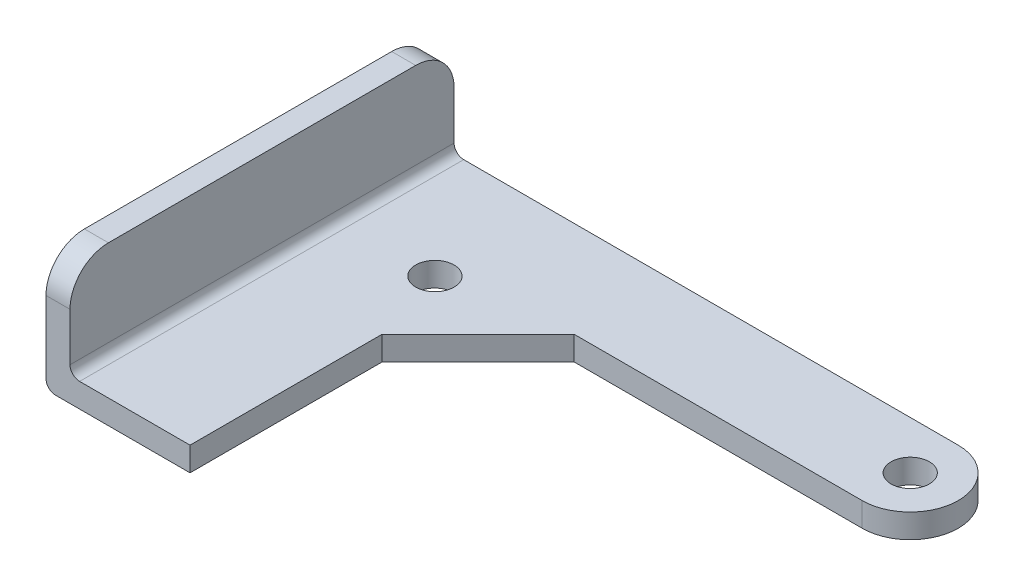
ISO-10303-21;
HEADER;
FILE_DESCRIPTION(('STEP AP214'),'2;1');
FILE_NAME('part.step','',(''),(''),'','','');
FILE_SCHEMA(('AUTOMOTIVE_DESIGN { 1 0 10303 214 1 1 1 1 }'));
ENDSEC;
DATA;
#1=APPLICATION_CONTEXT('core data for automotive mechanical design processes');
#2=APPLICATION_PROTOCOL_DEFINITION('international standard','automotive_design',2000,#1);
#3=PRODUCT_CONTEXT('',#1,'mechanical');
#4=PRODUCT('Part','Part','',(#3));
#5=PRODUCT_RELATED_PRODUCT_CATEGORY('part','',(#4));
#6=PRODUCT_DEFINITION_FORMATION('','',#4);
#7=PRODUCT_DEFINITION_CONTEXT('part definition',#1,'design');
#8=PRODUCT_DEFINITION('design','',#6,#7);
#9=PRODUCT_DEFINITION_SHAPE('','',#8);
#10=(LENGTH_UNIT() NAMED_UNIT(*) SI_UNIT(.MILLI.,.METRE.));
#11=(NAMED_UNIT(*) PLANE_ANGLE_UNIT() SI_UNIT($,.RADIAN.));
#12=(NAMED_UNIT(*) SI_UNIT($,.STERADIAN.) SOLID_ANGLE_UNIT());
#13=UNCERTAINTY_MEASURE_WITH_UNIT(LENGTH_MEASURE(1.E-05),#10,'distance_accuracy_value','');
#14=(GEOMETRIC_REPRESENTATION_CONTEXT(3) GLOBAL_UNCERTAINTY_ASSIGNED_CONTEXT((#13)) GLOBAL_UNIT_ASSIGNED_CONTEXT((#10,
#11,#12)) REPRESENTATION_CONTEXT('',''));
#15=CARTESIAN_POINT('',(0.,0.,0.));
#16=DIRECTION('',(0.,0.,1.));
#17=DIRECTION('',(1.,0.,0.));
#18=AXIS2_PLACEMENT_3D('',#15,#16,#17);
#19=CARTESIAN_POINT('',(0.,12.5,0.));
#20=DIRECTION('',(1.,0.,0.));
#21=DIRECTION('',(0.,0.,-1.));
#22=AXIS2_PLACEMENT_3D('',#19,#20,#21);
#23=PLANE('',#22);
#24=DIRECTION('',(0.,-1.,0.));
#25=VECTOR('',#24,1.);
#26=CARTESIAN_POINT('',(0.,12.5,0.));
#27=LINE('',#26,#25);
#28=CARTESIAN_POINT('',(0.,72.4999999999997,0.));
#29=VERTEX_POINT('',#28);
#30=CARTESIAN_POINT('',(0.,-2.5,0.));
#31=VERTEX_POINT('',#30);
#32=EDGE_CURVE('E152',#29,#31,#27,.T.);
#33=ORIENTED_EDGE('',*,*,#32,.T.);
#34=DIRECTION('',(0.,0.,1.));
#35=VECTOR('',#34,1.);
#36=CARTESIAN_POINT('',(0.,-2.5,400.));
#37=LINE('',#36,#35);
#38=CARTESIAN_POINT('',(0.,-2.5,400.));
#39=VERTEX_POINT('',#38);
#40=EDGE_CURVE('E197',#31,#39,#37,.T.);
#41=ORIENTED_EDGE('',*,*,#40,.T.);
#42=DIRECTION('',(0.,-1.,0.));
#43=VECTOR('',#42,1.);
#44=CARTESIAN_POINT('',(0.,12.5,400.));
#45=LINE('',#44,#43);
#46=CARTESIAN_POINT('',(0.,72.4999999999997,400.));
#47=VERTEX_POINT('',#46);
#48=EDGE_CURVE('E186',#47,#39,#45,.T.);
#49=ORIENTED_EDGE('',*,*,#48,.F.);
#50=CARTESIAN_POINT('',(0.,72.5,360.));
#51=DIRECTION('',(-1.,0.,0.));
#52=DIRECTION('',(0.,0.,1.));
#53=AXIS2_PLACEMENT_3D('',#50,#51,#52);
#54=CIRCLE('',#53,40.);
#55=CARTESIAN_POINT('',(0.,112.5,360.));
#56=VERTEX_POINT('',#55);
#57=EDGE_CURVE('E262',#47,#56,#54,.T.);
#58=ORIENTED_EDGE('',*,*,#57,.T.);
#59=DIRECTION('',(0.,0.,1.));
#60=VECTOR('',#59,1.);
#61=CARTESIAN_POINT('',(0.,112.5,0.));
#62=LINE('',#61,#60);
#63=CARTESIAN_POINT('',(0.,112.5,40.0000000000003));
#64=VERTEX_POINT('',#63);
#65=EDGE_CURVE('E156',#64,#56,#62,.T.);
#66=ORIENTED_EDGE('',*,*,#65,.F.);
#67=CARTESIAN_POINT('',(0.,72.5,40.));
#68=DIRECTION('',(-1.,0.,0.));
#69=DIRECTION('',(0.,0.,1.));
#70=AXIS2_PLACEMENT_3D('',#67,#68,#69);
#71=CIRCLE('',#70,40.);
#72=EDGE_CURVE('E138',#64,#29,#71,.T.);
#73=ORIENTED_EDGE('',*,*,#72,.T.);
#74=EDGE_LOOP('',(#33,#41,#49,#58,#66,#73));
#75=FACE_BOUND('',#74,.T.);
#76=ADVANCED_FACE('F41',(#75),#23,.F.);
#77=CARTESIAN_POINT('',(0.,12.5,0.));
#78=DIRECTION('',(0.,0.,1.));
#79=DIRECTION('',(1.,0.,0.));
#80=AXIS2_PLACEMENT_3D('',#77,#78,#79);
#81=PLANE('',#80);
#82=DIRECTION('',(-1.,0.,0.));
#83=VECTOR('',#82,1.);
#84=CARTESIAN_POINT('',(0.,-12.5,0.));
#85=LINE('',#84,#83);
#86=CARTESIAN_POINT('',(550.,-12.5,0.));
#87=VERTEX_POINT('',#86);
#88=CARTESIAN_POINT('',(10.,-12.5,0.));
#89=VERTEX_POINT('',#88);
#90=EDGE_CURVE('E172',#87,#89,#85,.T.);
#91=ORIENTED_EDGE('',*,*,#90,.T.);
#92=CARTESIAN_POINT('',(10.,-2.5,0.));
#93=DIRECTION('',(0.,0.,1.));
#94=DIRECTION('',(1.,0.,0.));
#95=AXIS2_PLACEMENT_3D('',#92,#93,#94);
#96=CIRCLE('',#95,10.);
#97=EDGE_CURVE('E161',#89,#31,#96,.F.);
#98=ORIENTED_EDGE('',*,*,#97,.T.);
#99=ORIENTED_EDGE('',*,*,#32,.F.);
#100=DIRECTION('',(-1.,0.,0.));
#101=VECTOR('',#100,1.);
#102=CARTESIAN_POINT('',(600.,72.4999999999997,0.));
#103=LINE('',#102,#101);
#104=CARTESIAN_POINT('',(25.,72.4999999999997,0.));
#105=VERTEX_POINT('',#104);
#106=EDGE_CURVE('E135',#105,#29,#103,.T.);
#107=ORIENTED_EDGE('',*,*,#106,.F.);
#108=DIRECTION('',(0.,-1.,0.));
#109=VECTOR('',#108,1.);
#110=CARTESIAN_POINT('',(25.,112.5,0.));
#111=LINE('',#110,#109);
#112=CARTESIAN_POINT('',(25.,22.5,0.));
#113=VERTEX_POINT('',#112);
#114=EDGE_CURVE('E202',#105,#113,#111,.T.);
#115=ORIENTED_EDGE('',*,*,#114,.T.);
#116=CARTESIAN_POINT('',(35.,22.5,0.));
#117=DIRECTION('',(0.,0.,1.));
#118=DIRECTION('',(1.,0.,0.));
#119=AXIS2_PLACEMENT_3D('',#116,#117,#118);
#120=CIRCLE('',#119,10.);
#121=CARTESIAN_POINT('',(35.,12.5,0.));
#122=VERTEX_POINT('',#121);
#123=EDGE_CURVE('E49',#113,#122,#120,.T.);
#124=ORIENTED_EDGE('',*,*,#123,.T.);
#125=DIRECTION('',(-1.,0.,0.));
#126=VECTOR('',#125,1.);
#127=CARTESIAN_POINT('',(0.,12.5,0.));
#128=LINE('',#127,#126);
#129=CARTESIAN_POINT('',(550.,12.5,0.));
#130=VERTEX_POINT('',#129);
#131=EDGE_CURVE('E163',#130,#122,#128,.T.);
#132=ORIENTED_EDGE('',*,*,#131,.F.);
#133=DIRECTION('',(0.,-1.,0.));
#134=VECTOR('',#133,1.);
#135=CARTESIAN_POINT('',(550.,12.5,0.));
#136=LINE('',#135,#134);
#137=EDGE_CURVE('E162',#130,#87,#136,.T.);
#138=ORIENTED_EDGE('',*,*,#137,.T.);
#139=EDGE_LOOP('',(#91,#98,#99,#107,#115,#124,#132,#138));
#140=FACE_BOUND('',#139,.T.);
#141=ADVANCED_FACE('F159',(#140),#81,.F.);
#142=CARTESIAN_POINT('',(25.,112.5,0.));
#143=DIRECTION('',(-1.,0.,0.));
#144=DIRECTION('',(0.,0.,1.));
#145=AXIS2_PLACEMENT_3D('',#142,#143,#144);
#146=PLANE('',#145);
#147=DIRECTION('',(0.,-1.,0.));
#148=VECTOR('',#147,1.);
#149=CARTESIAN_POINT('',(25.,112.5,400.));
#150=LINE('',#149,#148);
#151=CARTESIAN_POINT('',(25.,72.4999999999997,400.));
#152=VERTEX_POINT('',#151);
#153=CARTESIAN_POINT('',(25.,22.5,400.));
#154=VERTEX_POINT('',#153);
#155=EDGE_CURVE('E217',#152,#154,#150,.T.);
#156=ORIENTED_EDGE('',*,*,#155,.T.);
#157=DIRECTION('',(0.,0.,-1.));
#158=VECTOR('',#157,1.);
#159=CARTESIAN_POINT('',(25.,22.5,0.));
#160=LINE('',#159,#158);
#161=EDGE_CURVE('E192',#154,#113,#160,.T.);
#162=ORIENTED_EDGE('',*,*,#161,.T.);
#163=ORIENTED_EDGE('',*,*,#114,.F.);
#164=CARTESIAN_POINT('',(25.,72.5,40.));
#165=DIRECTION('',(-1.,0.,0.));
#166=DIRECTION('',(0.,0.,1.));
#167=AXIS2_PLACEMENT_3D('',#164,#165,#166);
#168=CIRCLE('',#167,40.);
#169=CARTESIAN_POINT('',(25.,112.5,40.0000000000003));
#170=VERTEX_POINT('',#169);
#171=EDGE_CURVE('E141',#170,#105,#168,.T.);
#172=ORIENTED_EDGE('',*,*,#171,.F.);
#173=DIRECTION('',(0.,0.,-1.));
#174=VECTOR('',#173,1.);
#175=CARTESIAN_POINT('',(25.,112.5,0.));
#176=LINE('',#175,#174);
#177=CARTESIAN_POINT('',(25.,112.5,360.));
#178=VERTEX_POINT('',#177);
#179=EDGE_CURVE('E229',#178,#170,#176,.T.);
#180=ORIENTED_EDGE('',*,*,#179,.F.);
#181=CARTESIAN_POINT('',(25.,72.5,360.));
#182=DIRECTION('',(-1.,0.,0.));
#183=DIRECTION('',(0.,0.,1.));
#184=AXIS2_PLACEMENT_3D('',#181,#182,#183);
#185=CIRCLE('',#184,40.);
#186=EDGE_CURVE('E146',#152,#178,#185,.T.);
#187=ORIENTED_EDGE('',*,*,#186,.F.);
#188=EDGE_LOOP('',(#156,#162,#163,#172,#180,#187));
#189=FACE_BOUND('',#188,.T.);
#190=ADVANCED_FACE('F222',(#189),#146,.F.);
#191=CARTESIAN_POINT('',(0.,112.5,0.));
#192=DIRECTION('',(0.,1.,0.));
#193=DIRECTION('',(0.,0.,1.));
#194=AXIS2_PLACEMENT_3D('',#191,#192,#193);
#195=PLANE('',#194);
#196=ORIENTED_EDGE('',*,*,#179,.T.);
#197=DIRECTION('',(-1.,0.,0.));
#198=VECTOR('',#197,1.);
#199=CARTESIAN_POINT('',(600.,112.5,39.9999999999999));
#200=LINE('',#199,#198);
#201=EDGE_CURVE('E190',#170,#64,#200,.T.);
#202=ORIENTED_EDGE('',*,*,#201,.T.);
#203=ORIENTED_EDGE('',*,*,#65,.T.);
#204=DIRECTION('',(-1.,0.,0.));
#205=VECTOR('',#204,1.);
#206=CARTESIAN_POINT('',(600.,112.5,360.));
#207=LINE('',#206,#205);
#208=EDGE_CURVE('E188',#178,#56,#207,.T.);
#209=ORIENTED_EDGE('',*,*,#208,.F.);
#210=EDGE_LOOP('',(#196,#202,#203,#209));
#211=FACE_BOUND('',#210,.T.);
#212=ADVANCED_FACE('F271',(#211),#195,.T.);
#213=CARTESIAN_POINT('',(550.,12.5,50.));
#214=DIRECTION('',(0.,-1.,0.));
#215=DIRECTION('',(0.,0.,-1.));
#216=AXIS2_PLACEMENT_3D('',#213,#214,#215);
#217=PLANE('',#216);
#218=CARTESIAN_POINT('',(125.,12.5,120.));
#219=DIRECTION('',(0.,1.,0.));
#220=DIRECTION('',(0.,0.,1.));
#221=AXIS2_PLACEMENT_3D('',#218,#219,#220);
#222=CIRCLE('',#221,20.);
#223=CARTESIAN_POINT('',(125.,12.5,140.));
#224=VERTEX_POINT('',#223);
#225=EDGE_CURVE('E227',#224,#224,#222,.T.);
#226=ORIENTED_EDGE('',*,*,#225,.F.);
#227=EDGE_LOOP('',(#226));
#228=FACE_BOUND('',#227,.T.);
#229=CARTESIAN_POINT('',(550.,12.5,50.));
#230=DIRECTION('',(0.,1.,0.));
#231=DIRECTION('',(0.,0.,1.));
#232=AXIS2_PLACEMENT_3D('',#229,#230,#231);
#233=CIRCLE('',#232,20.);
#234=CARTESIAN_POINT('',(550.,12.5,70.));
#235=VERTEX_POINT('',#234);
#236=EDGE_CURVE('E236',#235,#235,#233,.T.);
#237=ORIENTED_EDGE('',*,*,#236,.F.);
#238=EDGE_LOOP('',(#237));
#239=FACE_BOUND('',#238,.T.);
#240=ORIENTED_EDGE('',*,*,#131,.T.);
#241=DIRECTION('',(0.,0.,-1.));
#242=VECTOR('',#241,1.);
#243=CARTESIAN_POINT('',(35.,12.5,400.));
#244=LINE('',#243,#242);
#245=CARTESIAN_POINT('',(35.,12.5,400.));
#246=VERTEX_POINT('',#245);
#247=EDGE_CURVE('E195',#122,#246,#244,.F.);
#248=ORIENTED_EDGE('',*,*,#247,.T.);
#249=DIRECTION('',(1.,0.,0.));
#250=VECTOR('',#249,1.);
#251=CARTESIAN_POINT('',(0.,12.5,400.));
#252=LINE('',#251,#250);
#253=CARTESIAN_POINT('',(150.,12.5,400.));
#254=VERTEX_POINT('',#253);
#255=EDGE_CURVE('E219',#246,#254,#252,.T.);
#256=ORIENTED_EDGE('',*,*,#255,.T.);
#257=DIRECTION('',(0.,0.,-1.));
#258=VECTOR('',#257,1.);
#259=CARTESIAN_POINT('',(150.,12.5,400.));
#260=LINE('',#259,#258);
#261=CARTESIAN_POINT('',(150.,12.5,200.));
#262=VERTEX_POINT('',#261);
#263=EDGE_CURVE('E243',#254,#262,#260,.T.);
#264=ORIENTED_EDGE('',*,*,#263,.T.);
#265=DIRECTION('',(0.707106781186546,0.,-0.707106781186549));
#266=VECTOR('',#265,1.);
#267=CARTESIAN_POINT('',(150.,12.5,200.));
#268=LINE('',#267,#266);
#269=CARTESIAN_POINT('',(250.,12.5,100.));
#270=VERTEX_POINT('',#269);
#271=EDGE_CURVE('E245',#262,#270,#268,.T.);
#272=ORIENTED_EDGE('',*,*,#271,.T.);
#273=DIRECTION('',(1.,0.,0.));
#274=VECTOR('',#273,1.);
#275=CARTESIAN_POINT('',(250.,12.5,100.));
#276=LINE('',#275,#274);
#277=CARTESIAN_POINT('',(550.,12.5,100.));
#278=VERTEX_POINT('',#277);
#279=EDGE_CURVE('E247',#270,#278,#276,.T.);
#280=ORIENTED_EDGE('',*,*,#279,.T.);
#281=CARTESIAN_POINT('',(550.,12.5,50.));
#282=DIRECTION('',(0.,1.,0.));
#283=DIRECTION('',(0.,0.,-1.));
#284=AXIS2_PLACEMENT_3D('',#281,#282,#283);
#285=CIRCLE('',#284,50.);
#286=EDGE_CURVE('E169',#278,#130,#285,.T.);
#287=ORIENTED_EDGE('',*,*,#286,.T.);
#288=EDGE_LOOP('',(#240,#248,#256,#264,#272,#280,#287));
#289=FACE_BOUND('',#288,.T.);
#290=ADVANCED_FACE('F207',(#228,#239,#289),#217,.F.);
#291=CARTESIAN_POINT('',(550.,-12.5,50.));
#292=DIRECTION('',(0.,-1.,0.));
#293=DIRECTION('',(0.,0.,-1.));
#294=AXIS2_PLACEMENT_3D('',#291,#292,#293);
#295=PLANE('',#294);
#296=CARTESIAN_POINT('',(550.,-12.5,50.));
#297=DIRECTION('',(0.,1.,0.));
#298=DIRECTION('',(0.,0.,1.));
#299=AXIS2_PLACEMENT_3D('',#296,#297,#298);
#300=CIRCLE('',#299,20.);
#301=CARTESIAN_POINT('',(550.,-12.5,70.));
#302=VERTEX_POINT('',#301);
#303=EDGE_CURVE('E234',#302,#302,#300,.T.);
#304=ORIENTED_EDGE('',*,*,#303,.T.);
#305=EDGE_LOOP('',(#304));
#306=FACE_BOUND('',#305,.T.);
#307=DIRECTION('',(1.,0.,0.));
#308=VECTOR('',#307,1.);
#309=CARTESIAN_POINT('',(0.,-12.5,400.));
#310=LINE('',#309,#308);
#311=CARTESIAN_POINT('',(10.,-12.5,400.));
#312=VERTEX_POINT('',#311);
#313=CARTESIAN_POINT('',(150.,-12.5,400.));
#314=VERTEX_POINT('',#313);
#315=EDGE_CURVE('E239',#312,#314,#310,.T.);
#316=ORIENTED_EDGE('',*,*,#315,.F.);
#317=DIRECTION('',(0.,0.,1.));
#318=VECTOR('',#317,1.);
#319=CARTESIAN_POINT('',(10.,-12.5,0.));
#320=LINE('',#319,#318);
#321=EDGE_CURVE('E56',#312,#89,#320,.F.);
#322=ORIENTED_EDGE('',*,*,#321,.T.);
#323=ORIENTED_EDGE('',*,*,#90,.F.);
#324=CARTESIAN_POINT('',(550.,-12.5,50.));
#325=DIRECTION('',(0.,1.,0.));
#326=DIRECTION('',(0.,0.,-1.));
#327=AXIS2_PLACEMENT_3D('',#324,#325,#326);
#328=CIRCLE('',#327,50.);
#329=CARTESIAN_POINT('',(550.,-12.5,100.));
#330=VERTEX_POINT('',#329);
#331=EDGE_CURVE('E256',#330,#87,#328,.T.);
#332=ORIENTED_EDGE('',*,*,#331,.F.);
#333=DIRECTION('',(1.,0.,0.));
#334=VECTOR('',#333,1.);
#335=CARTESIAN_POINT('',(250.,-12.5,100.));
#336=LINE('',#335,#334);
#337=CARTESIAN_POINT('',(250.,-12.5,100.));
#338=VERTEX_POINT('',#337);
#339=EDGE_CURVE('E255',#338,#330,#336,.T.);
#340=ORIENTED_EDGE('',*,*,#339,.F.);
#341=DIRECTION('',(0.707106781186546,0.,-0.707106781186549));
#342=VECTOR('',#341,1.);
#343=CARTESIAN_POINT('',(150.,-12.5,200.));
#344=LINE('',#343,#342);
#345=CARTESIAN_POINT('',(150.,-12.5,200.));
#346=VERTEX_POINT('',#345);
#347=EDGE_CURVE('E253',#346,#338,#344,.T.);
#348=ORIENTED_EDGE('',*,*,#347,.F.);
#349=DIRECTION('',(0.,0.,-1.));
#350=VECTOR('',#349,1.);
#351=CARTESIAN_POINT('',(150.,-12.5,400.));
#352=LINE('',#351,#350);
#353=EDGE_CURVE('E251',#314,#346,#352,.T.);
#354=ORIENTED_EDGE('',*,*,#353,.F.);
#355=EDGE_LOOP('',(#316,#322,#323,#332,#340,#348,#354));
#356=FACE_BOUND('',#355,.T.);
#357=CARTESIAN_POINT('',(125.,-12.5,120.));
#358=DIRECTION('',(0.,1.,0.));
#359=DIRECTION('',(0.,0.,1.));
#360=AXIS2_PLACEMENT_3D('',#357,#358,#359);
#361=CIRCLE('',#360,20.);
#362=CARTESIAN_POINT('',(125.,-12.5,140.));
#363=VERTEX_POINT('',#362);
#364=EDGE_CURVE('E224',#363,#363,#361,.T.);
#365=ORIENTED_EDGE('',*,*,#364,.T.);
#366=EDGE_LOOP('',(#365));
#367=FACE_BOUND('',#366,.T.);
#368=ADVANCED_FACE('F316',(#306,#356,#367),#295,.T.);
#369=CARTESIAN_POINT('',(0.,12.5,400.));
#370=DIRECTION('',(0.,0.,-1.));
#371=DIRECTION('',(-1.,0.,0.));
#372=AXIS2_PLACEMENT_3D('',#369,#370,#371);
#373=PLANE('',#372);
#374=ORIENTED_EDGE('',*,*,#48,.T.);
#375=CARTESIAN_POINT('',(10.,-2.5,400.));
#376=DIRECTION('',(0.,0.,-1.));
#377=DIRECTION('',(-1.,0.,0.));
#378=AXIS2_PLACEMENT_3D('',#375,#376,#377);
#379=CIRCLE('',#378,10.);
#380=EDGE_CURVE('E64',#39,#312,#379,.F.);
#381=ORIENTED_EDGE('',*,*,#380,.T.);
#382=ORIENTED_EDGE('',*,*,#315,.T.);
#383=DIRECTION('',(0.,-1.,0.));
#384=VECTOR('',#383,1.);
#385=CARTESIAN_POINT('',(150.,12.5,400.));
#386=LINE('',#385,#384);
#387=EDGE_CURVE('E183',#254,#314,#386,.T.);
#388=ORIENTED_EDGE('',*,*,#387,.F.);
#389=ORIENTED_EDGE('',*,*,#255,.F.);
#390=CARTESIAN_POINT('',(35.,22.5,400.));
#391=DIRECTION('',(0.,0.,-1.));
#392=DIRECTION('',(-1.,0.,0.));
#393=AXIS2_PLACEMENT_3D('',#390,#391,#392);
#394=CIRCLE('',#393,10.);
#395=EDGE_CURVE('E11',#246,#154,#394,.T.);
#396=ORIENTED_EDGE('',*,*,#395,.T.);
#397=ORIENTED_EDGE('',*,*,#155,.F.);
#398=DIRECTION('',(-1.,0.,0.));
#399=VECTOR('',#398,1.);
#400=CARTESIAN_POINT('',(600.,72.4999999999997,400.));
#401=LINE('',#400,#399);
#402=EDGE_CURVE('E157',#152,#47,#401,.T.);
#403=ORIENTED_EDGE('',*,*,#402,.T.);
#404=EDGE_LOOP('',(#374,#381,#382,#388,#389,#396,#397,#403));
#405=FACE_BOUND('',#404,.T.);
#406=ADVANCED_FACE('F215',(#405),#373,.F.);
#407=CARTESIAN_POINT('',(150.,12.5,400.));
#408=DIRECTION('',(-1.,0.,0.));
#409=DIRECTION('',(0.,0.,1.));
#410=AXIS2_PLACEMENT_3D('',#407,#408,#409);
#411=PLANE('',#410);
#412=ORIENTED_EDGE('',*,*,#353,.T.);
#413=DIRECTION('',(0.,-1.,0.));
#414=VECTOR('',#413,1.);
#415=CARTESIAN_POINT('',(150.,12.5,200.));
#416=LINE('',#415,#414);
#417=EDGE_CURVE('E180',#262,#346,#416,.T.);
#418=ORIENTED_EDGE('',*,*,#417,.F.);
#419=ORIENTED_EDGE('',*,*,#263,.F.);
#420=ORIENTED_EDGE('',*,*,#387,.T.);
#421=EDGE_LOOP('',(#412,#418,#419,#420));
#422=FACE_BOUND('',#421,.T.);
#423=ADVANCED_FACE('F315',(#422),#411,.F.);
#424=CARTESIAN_POINT('',(150.,12.5,200.));
#425=DIRECTION('',(-0.707106781186549,0.,-0.707106781186546));
#426=DIRECTION('',(-0.707106781186546,0.,0.707106781186549));
#427=AXIS2_PLACEMENT_3D('',#424,#425,#426);
#428=PLANE('',#427);
#429=ORIENTED_EDGE('',*,*,#347,.T.);
#430=DIRECTION('',(0.,-1.,0.));
#431=VECTOR('',#430,1.);
#432=CARTESIAN_POINT('',(250.,12.5,100.));
#433=LINE('',#432,#431);
#434=EDGE_CURVE('E177',#270,#338,#433,.T.);
#435=ORIENTED_EDGE('',*,*,#434,.F.);
#436=ORIENTED_EDGE('',*,*,#271,.F.);
#437=ORIENTED_EDGE('',*,*,#417,.T.);
#438=EDGE_LOOP('',(#429,#435,#436,#437));
#439=FACE_BOUND('',#438,.T.);
#440=ADVANCED_FACE('F413',(#439),#428,.F.);
#441=CARTESIAN_POINT('',(250.,12.5,100.));
#442=DIRECTION('',(0.,0.,-1.));
#443=DIRECTION('',(-1.,0.,0.));
#444=AXIS2_PLACEMENT_3D('',#441,#442,#443);
#445=PLANE('',#444);
#446=ORIENTED_EDGE('',*,*,#339,.T.);
#447=DIRECTION('',(0.,-1.,0.));
#448=VECTOR('',#447,1.);
#449=CARTESIAN_POINT('',(550.,12.5,100.));
#450=LINE('',#449,#448);
#451=EDGE_CURVE('E166',#278,#330,#450,.T.);
#452=ORIENTED_EDGE('',*,*,#451,.F.);
#453=ORIENTED_EDGE('',*,*,#279,.F.);
#454=ORIENTED_EDGE('',*,*,#434,.T.);
#455=EDGE_LOOP('',(#446,#452,#453,#454));
#456=FACE_BOUND('',#455,.T.);
#457=ADVANCED_FACE('F403',(#456),#445,.F.);
#458=CARTESIAN_POINT('',(550.,12.5,50.));
#459=DIRECTION('',(0.,-1.,0.));
#460=DIRECTION('',(0.,0.,-1.));
#461=AXIS2_PLACEMENT_3D('',#458,#459,#460);
#462=CYLINDRICAL_SURFACE('',#461,50.);
#463=ORIENTED_EDGE('',*,*,#331,.T.);
#464=ORIENTED_EDGE('',*,*,#137,.F.);
#465=ORIENTED_EDGE('',*,*,#286,.F.);
#466=ORIENTED_EDGE('',*,*,#451,.T.);
#467=EDGE_LOOP('',(#463,#464,#465,#466));
#468=FACE_BOUND('',#467,.T.);
#469=ADVANCED_FACE('F392',(#468),#462,.T.);
#470=CARTESIAN_POINT('',(550.,12.5,50.));
#471=DIRECTION('',(0.,-1.,0.));
#472=DIRECTION('',(0.,0.,-1.));
#473=AXIS2_PLACEMENT_3D('',#470,#471,#472);
#474=CYLINDRICAL_SURFACE('',#473,20.);
#475=ORIENTED_EDGE('',*,*,#236,.T.);
#476=EDGE_LOOP('',(#475));
#477=FACE_BOUND('',#476,.T.);
#478=ORIENTED_EDGE('',*,*,#303,.F.);
#479=EDGE_LOOP('',(#478));
#480=FACE_BOUND('',#479,.T.);
#481=ADVANCED_FACE('F281',(#477,#480),#474,.F.);
#482=CARTESIAN_POINT('',(125.,12.5,120.));
#483=DIRECTION('',(0.,-1.,0.));
#484=DIRECTION('',(0.,0.,-1.));
#485=AXIS2_PLACEMENT_3D('',#482,#483,#484);
#486=CYLINDRICAL_SURFACE('',#485,20.);
#487=ORIENTED_EDGE('',*,*,#225,.T.);
#488=EDGE_LOOP('',(#487));
#489=FACE_BOUND('',#488,.T.);
#490=ORIENTED_EDGE('',*,*,#364,.F.);
#491=EDGE_LOOP('',(#490));
#492=FACE_BOUND('',#491,.T.);
#493=ADVANCED_FACE('F274',(#489,#492),#486,.F.);
#494=CARTESIAN_POINT('',(600.,72.5,360.));
#495=DIRECTION('',(-1.,0.,0.));
#496=DIRECTION('',(0.,0.,1.));
#497=AXIS2_PLACEMENT_3D('',#494,#495,#496);
#498=CYLINDRICAL_SURFACE('',#497,40.);
#499=ORIENTED_EDGE('',*,*,#186,.T.);
#500=ORIENTED_EDGE('',*,*,#208,.T.);
#501=ORIENTED_EDGE('',*,*,#57,.F.);
#502=ORIENTED_EDGE('',*,*,#402,.F.);
#503=EDGE_LOOP('',(#499,#500,#501,#502));
#504=FACE_BOUND('',#503,.T.);
#505=ADVANCED_FACE('F272',(#504),#498,.T.);
#506=CARTESIAN_POINT('',(600.,72.5,39.9999999999999));
#507=DIRECTION('',(-1.,0.,0.));
#508=DIRECTION('',(0.,0.,1.));
#509=AXIS2_PLACEMENT_3D('',#506,#507,#508);
#510=CYLINDRICAL_SURFACE('',#509,40.);
#511=ORIENTED_EDGE('',*,*,#171,.T.);
#512=ORIENTED_EDGE('',*,*,#106,.T.);
#513=ORIENTED_EDGE('',*,*,#72,.F.);
#514=ORIENTED_EDGE('',*,*,#201,.F.);
#515=EDGE_LOOP('',(#511,#512,#513,#514));
#516=FACE_BOUND('',#515,.T.);
#517=ADVANCED_FACE('F137',(#516),#510,.T.);
#518=CARTESIAN_POINT('',(35.,22.5,0.));
#519=DIRECTION('',(0.,0.,1.));
#520=DIRECTION('',(1.,0.,0.));
#521=AXIS2_PLACEMENT_3D('',#518,#519,#520);
#522=CYLINDRICAL_SURFACE('',#521,10.);
#523=ORIENTED_EDGE('',*,*,#395,.F.);
#524=ORIENTED_EDGE('',*,*,#247,.F.);
#525=ORIENTED_EDGE('',*,*,#123,.F.);
#526=ORIENTED_EDGE('',*,*,#161,.F.);
#527=EDGE_LOOP('',(#523,#524,#525,#526));
#528=FACE_BOUND('',#527,.T.);
#529=ADVANCED_FACE('F212',(#528),#522,.F.);
#530=CARTESIAN_POINT('',(10.,-2.5,0.));
#531=DIRECTION('',(0.,0.,-1.));
#532=DIRECTION('',(-1.,0.,0.));
#533=AXIS2_PLACEMENT_3D('',#530,#531,#532);
#534=CYLINDRICAL_SURFACE('',#533,10.);
#535=ORIENTED_EDGE('',*,*,#97,.F.);
#536=ORIENTED_EDGE('',*,*,#321,.F.);
#537=ORIENTED_EDGE('',*,*,#380,.F.);
#538=ORIENTED_EDGE('',*,*,#40,.F.);
#539=EDGE_LOOP('',(#535,#536,#537,#538));
#540=FACE_BOUND('',#539,.T.);
#541=ADVANCED_FACE('F43',(#540),#534,.T.);
#542=CLOSED_SHELL('',(#76,#141,#190,#212,#290,#368,#406,#423,#440,#457,#469,#481,#493,#505,#517,
#529,#541));
#543=MANIFOLD_SOLID_BREP('B2',#542);
#544=ADVANCED_BREP_SHAPE_REPRESENTATION('',(#18,#543),#14);
#545=SHAPE_DEFINITION_REPRESENTATION(#9,#544);
ENDSEC;
END-ISO-10303-21;
